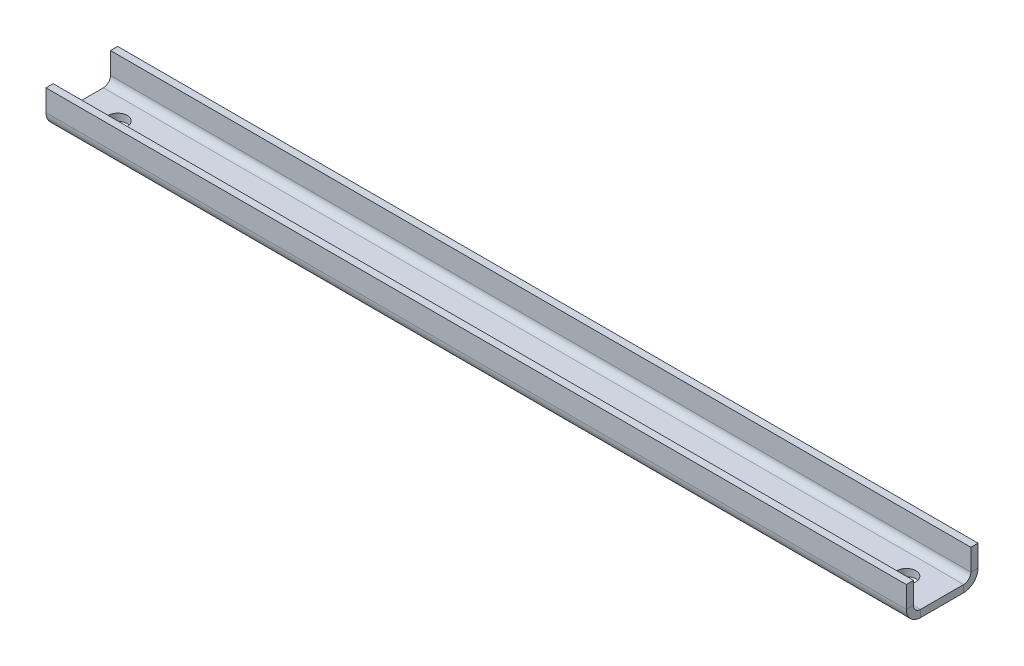
ISO-10303-21;
HEADER;
FILE_DESCRIPTION(('STEP AP214'),'2;1');
FILE_NAME('part.step','',(''),(''),'','','');
FILE_SCHEMA(('AUTOMOTIVE_DESIGN { 1 0 10303 214 1 1 1 1 }'));
ENDSEC;
DATA;
#1=APPLICATION_CONTEXT('core data for automotive mechanical design processes');
#2=APPLICATION_PROTOCOL_DEFINITION('international standard','automotive_design',2000,#1);
#3=PRODUCT_CONTEXT('',#1,'mechanical');
#4=PRODUCT('Part','Part','',(#3));
#5=PRODUCT_RELATED_PRODUCT_CATEGORY('part','',(#4));
#6=PRODUCT_DEFINITION_FORMATION('','',#4);
#7=PRODUCT_DEFINITION_CONTEXT('part definition',#1,'design');
#8=PRODUCT_DEFINITION('design','',#6,#7);
#9=PRODUCT_DEFINITION_SHAPE('','',#8);
#10=(LENGTH_UNIT() NAMED_UNIT(*) SI_UNIT(.MILLI.,.METRE.));
#11=(NAMED_UNIT(*) PLANE_ANGLE_UNIT() SI_UNIT($,.RADIAN.));
#12=(NAMED_UNIT(*) SI_UNIT($,.STERADIAN.) SOLID_ANGLE_UNIT());
#13=UNCERTAINTY_MEASURE_WITH_UNIT(LENGTH_MEASURE(1.E-05),#10,'distance_accuracy_value','');
#14=(GEOMETRIC_REPRESENTATION_CONTEXT(3) GLOBAL_UNCERTAINTY_ASSIGNED_CONTEXT((#13)) GLOBAL_UNIT_ASSIGNED_CONTEXT((#10,
#11,#12)) REPRESENTATION_CONTEXT('',''));
#15=CARTESIAN_POINT('',(0.,0.,0.));
#16=DIRECTION('',(0.,0.,1.));
#17=DIRECTION('',(1.,0.,0.));
#18=AXIS2_PLACEMENT_3D('',#15,#16,#17);
#19=CARTESIAN_POINT('',(0.,-3.,0.));
#20=DIRECTION('',(0.,-1.,0.));
#21=DIRECTION('',(0.,0.,-1.));
#22=AXIS2_PLACEMENT_3D('',#19,#20,#21);
#23=PLANE('',#22);
#24=CARTESIAN_POINT('',(345.,-3.,-15.));
#25=DIRECTION('',(0.,-1.,0.));
#26=DIRECTION('',(0.,0.,-1.));
#27=AXIS2_PLACEMENT_3D('',#24,#25,#26);
#28=CIRCLE('',#27,3.99999999999999);
#29=CARTESIAN_POINT('',(345.,-3.,-19.));
#30=VERTEX_POINT('',#29);
#31=EDGE_CURVE('E598',#30,#30,#28,.F.);
#32=ORIENTED_EDGE('',*,*,#31,.T.);
#33=EDGE_LOOP('',(#32));
#34=FACE_BOUND('',#33,.T.);
#35=CARTESIAN_POINT('',(15.,-3.,-15.));
#36=DIRECTION('',(0.,-1.,0.));
#37=DIRECTION('',(0.,0.,-1.));
#38=AXIS2_PLACEMENT_3D('',#35,#36,#37);
#39=CIRCLE('',#38,4.);
#40=CARTESIAN_POINT('',(15.,-3.,-19.));
#41=VERTEX_POINT('',#40);
#42=EDGE_CURVE('E592',#41,#41,#39,.F.);
#43=ORIENTED_EDGE('',*,*,#42,.T.);
#44=EDGE_LOOP('',(#43));
#45=FACE_BOUND('',#44,.T.);
#46=DIRECTION('',(0.,0.,1.));
#47=VECTOR('',#46,1.);
#48=CARTESIAN_POINT('',(0.,-3.,0.));
#49=LINE('',#48,#47);
#50=CARTESIAN_POINT('',(0.,-3.00000000000003,-24.));
#51=VERTEX_POINT('',#50);
#52=CARTESIAN_POINT('',(0.,-3.,-6.));
#53=VERTEX_POINT('',#52);
#54=EDGE_CURVE('E86',#51,#53,#49,.T.);
#55=ORIENTED_EDGE('',*,*,#54,.F.);
#56=DIRECTION('',(-1.,0.,0.));
#57=VECTOR('',#56,1.);
#58=CARTESIAN_POINT('',(0.,-3.00000000000003,-24.));
#59=LINE('',#58,#57);
#60=CARTESIAN_POINT('',(360.,-3.,-24.));
#61=VERTEX_POINT('',#60);
#62=EDGE_CURVE('E210',#51,#61,#59,.F.);
#63=ORIENTED_EDGE('',*,*,#62,.T.);
#64=DIRECTION('',(0.,0.,-1.));
#65=VECTOR('',#64,1.);
#66=CARTESIAN_POINT('',(360.,-3.,0.));
#67=LINE('',#66,#65);
#68=CARTESIAN_POINT('',(360.,-3.00000000000001,-6.));
#69=VERTEX_POINT('',#68);
#70=EDGE_CURVE('E13',#69,#61,#67,.T.);
#71=ORIENTED_EDGE('',*,*,#70,.F.);
#72=DIRECTION('',(1.,0.,0.));
#73=VECTOR('',#72,1.);
#74=CARTESIAN_POINT('',(360.,-3.00000000000001,-6.));
#75=LINE('',#74,#73);
#76=EDGE_CURVE('E261',#69,#53,#75,.F.);
#77=ORIENTED_EDGE('',*,*,#76,.T.);
#78=EDGE_LOOP('',(#55,#63,#71,#77));
#79=FACE_BOUND('',#78,.T.);
#80=ADVANCED_FACE('F77',(#34,#45,#79),#23,.T.);
#81=CARTESIAN_POINT('',(0.,0.,0.));
#82=DIRECTION('',(0.,-1.,0.));
#83=DIRECTION('',(0.,0.,-1.));
#84=AXIS2_PLACEMENT_3D('',#81,#82,#83);
#85=PLANE('',#84);
#86=CARTESIAN_POINT('',(345.,0.,-15.));
#87=DIRECTION('',(0.,1.,0.));
#88=DIRECTION('',(0.,0.,1.));
#89=AXIS2_PLACEMENT_3D('',#86,#87,#88);
#90=CIRCLE('',#89,3.99999999999999);
#91=CARTESIAN_POINT('',(345.,0.,-11.));
#92=VERTEX_POINT('',#91);
#93=EDGE_CURVE('E595',#92,#92,#90,.T.);
#94=ORIENTED_EDGE('',*,*,#93,.F.);
#95=EDGE_LOOP('',(#94));
#96=FACE_BOUND('',#95,.T.);
#97=CARTESIAN_POINT('',(15.,0.,-15.));
#98=DIRECTION('',(0.,1.,0.));
#99=DIRECTION('',(0.,0.,1.));
#100=AXIS2_PLACEMENT_3D('',#97,#98,#99);
#101=CIRCLE('',#100,4.);
#102=CARTESIAN_POINT('',(15.,0.,-11.));
#103=VERTEX_POINT('',#102);
#104=EDGE_CURVE('E209',#103,#103,#101,.T.);
#105=ORIENTED_EDGE('',*,*,#104,.F.);
#106=EDGE_LOOP('',(#105));
#107=FACE_BOUND('',#106,.T.);
#108=DIRECTION('',(-1.,0.,0.));
#109=VECTOR('',#108,1.);
#110=CARTESIAN_POINT('',(0.,0.,-24.));
#111=LINE('',#110,#109);
#112=CARTESIAN_POINT('',(0.,0.,-24.));
#113=VERTEX_POINT('',#112);
#114=CARTESIAN_POINT('',(360.,0.,-24.));
#115=VERTEX_POINT('',#114);
#116=EDGE_CURVE('E221',#113,#115,#111,.F.);
#117=ORIENTED_EDGE('',*,*,#116,.F.);
#118=DIRECTION('',(0.,0.,1.));
#119=VECTOR('',#118,1.);
#120=CARTESIAN_POINT('',(0.,0.,0.));
#121=LINE('',#120,#119);
#122=CARTESIAN_POINT('',(0.,0.,-6.));
#123=VERTEX_POINT('',#122);
#124=EDGE_CURVE('E278',#113,#123,#121,.T.);
#125=ORIENTED_EDGE('',*,*,#124,.T.);
#126=DIRECTION('',(1.,0.,0.));
#127=VECTOR('',#126,1.);
#128=CARTESIAN_POINT('',(360.,0.,-6.));
#129=LINE('',#128,#127);
#130=CARTESIAN_POINT('',(360.,0.,-6.));
#131=VERTEX_POINT('',#130);
#132=EDGE_CURVE('E272',#131,#123,#129,.F.);
#133=ORIENTED_EDGE('',*,*,#132,.F.);
#134=DIRECTION('',(0.,0.,-1.));
#135=VECTOR('',#134,1.);
#136=CARTESIAN_POINT('',(360.,0.,0.));
#137=LINE('',#136,#135);
#138=EDGE_CURVE('E81',#131,#115,#137,.T.);
#139=ORIENTED_EDGE('',*,*,#138,.T.);
#140=EDGE_LOOP('',(#117,#125,#133,#139));
#141=FACE_BOUND('',#140,.T.);
#142=ADVANCED_FACE('F290',(#96,#107,#141),#85,.F.);
#143=CARTESIAN_POINT('',(0.,-3.,0.));
#144=DIRECTION('',(-1.,0.,0.));
#145=DIRECTION('',(0.,0.,1.));
#146=AXIS2_PLACEMENT_3D('',#143,#144,#145);
#147=PLANE('',#146);
#148=ORIENTED_EDGE('',*,*,#124,.F.);
#149=DIRECTION('',(0.,-1.,0.));
#150=VECTOR('',#149,1.);
#151=CARTESIAN_POINT('',(0.,0.,-24.));
#152=LINE('',#151,#150);
#153=EDGE_CURVE('E215',#113,#51,#152,.T.);
#154=ORIENTED_EDGE('',*,*,#153,.T.);
#155=ORIENTED_EDGE('',*,*,#54,.T.);
#156=DIRECTION('',(0.,-1.,0.));
#157=VECTOR('',#156,1.);
#158=CARTESIAN_POINT('',(0.,0.,-6.));
#159=LINE('',#158,#157);
#160=EDGE_CURVE('E276',#123,#53,#159,.T.);
#161=ORIENTED_EDGE('',*,*,#160,.F.);
#162=EDGE_LOOP('',(#148,#154,#155,#161));
#163=FACE_BOUND('',#162,.T.);
#164=ADVANCED_FACE('F79',(#163),#147,.T.);
#165=CARTESIAN_POINT('',(360.,-3.,0.));
#166=DIRECTION('',(1.,0.,0.));
#167=DIRECTION('',(0.,0.,-1.));
#168=AXIS2_PLACEMENT_3D('',#165,#166,#167);
#169=PLANE('',#168);
#170=DIRECTION('',(0.,-1.,0.));
#171=VECTOR('',#170,1.);
#172=CARTESIAN_POINT('',(360.,0.,-24.));
#173=LINE('',#172,#171);
#174=EDGE_CURVE('E226',#115,#61,#173,.T.);
#175=ORIENTED_EDGE('',*,*,#174,.F.);
#176=ORIENTED_EDGE('',*,*,#138,.F.);
#177=DIRECTION('',(0.,-1.,0.));
#178=VECTOR('',#177,1.);
#179=CARTESIAN_POINT('',(360.,0.,-6.));
#180=LINE('',#179,#178);
#181=EDGE_CURVE('E266',#131,#69,#180,.T.);
#182=ORIENTED_EDGE('',*,*,#181,.T.);
#183=ORIENTED_EDGE('',*,*,#70,.T.);
#184=EDGE_LOOP('',(#175,#176,#182,#183));
#185=FACE_BOUND('',#184,.T.);
#186=ADVANCED_FACE('F293',(#185),#169,.T.);
#187=CARTESIAN_POINT('',(0.,2.99999999999999,-6.));
#188=DIRECTION('',(-1.,0.,0.));
#189=DIRECTION('',(0.,0.,1.));
#190=AXIS2_PLACEMENT_3D('',#187,#188,#189);
#191=PLANE('',#190);
#192=DIRECTION('',(0.,0.,-1.));
#193=VECTOR('',#192,1.);
#194=CARTESIAN_POINT('',(0.,2.99999999999999,0.));
#195=LINE('',#194,#193);
#196=CARTESIAN_POINT('',(0.,2.99999999999999,-3.));
#197=VERTEX_POINT('',#196);
#198=CARTESIAN_POINT('',(0.,2.99999999999999,0.));
#199=VERTEX_POINT('',#198);
#200=EDGE_CURVE('E228',#197,#199,#195,.F.);
#201=ORIENTED_EDGE('',*,*,#200,.F.);
#202=CARTESIAN_POINT('',(0.,2.99999999999999,-6.));
#203=DIRECTION('',(1.,0.,0.));
#204=DIRECTION('',(0.,0.,-1.));
#205=AXIS2_PLACEMENT_3D('',#202,#203,#204);
#206=CIRCLE('',#205,3.);
#207=EDGE_CURVE('E269',#123,#197,#206,.F.);
#208=ORIENTED_EDGE('',*,*,#207,.F.);
#209=ORIENTED_EDGE('',*,*,#160,.T.);
#210=CARTESIAN_POINT('',(0.,2.99999999999999,-6.));
#211=DIRECTION('',(1.,0.,0.));
#212=DIRECTION('',(0.,0.,-1.));
#213=AXIS2_PLACEMENT_3D('',#210,#211,#212);
#214=CIRCLE('',#213,6.);
#215=EDGE_CURVE('E94',#53,#199,#214,.F.);
#216=ORIENTED_EDGE('',*,*,#215,.T.);
#217=EDGE_LOOP('',(#201,#208,#209,#216));
#218=FACE_BOUND('',#217,.T.);
#219=ADVANCED_FACE('F308',(#218),#191,.T.);
#220=CARTESIAN_POINT('',(360.,2.99999999999999,-6.));
#221=DIRECTION('',(-1.,0.,0.));
#222=DIRECTION('',(0.,0.,1.));
#223=AXIS2_PLACEMENT_3D('',#220,#221,#222);
#224=PLANE('',#223);
#225=CARTESIAN_POINT('',(360.,2.99999999999999,-6.));
#226=DIRECTION('',(1.,0.,0.));
#227=DIRECTION('',(0.,0.,-1.));
#228=AXIS2_PLACEMENT_3D('',#225,#226,#227);
#229=CIRCLE('',#228,3.);
#230=CARTESIAN_POINT('',(360.,2.99999999999999,-3.));
#231=VERTEX_POINT('',#230);
#232=EDGE_CURVE('E234',#231,#131,#229,.T.);
#233=ORIENTED_EDGE('',*,*,#232,.F.);
#234=DIRECTION('',(0.,0.,-1.));
#235=VECTOR('',#234,1.);
#236=CARTESIAN_POINT('',(360.,2.99999999999999,-2.99999999999999));
#237=LINE('',#236,#235);
#238=CARTESIAN_POINT('',(360.,2.99999999999999,0.));
#239=VERTEX_POINT('',#238);
#240=EDGE_CURVE('E254',#231,#239,#237,.F.);
#241=ORIENTED_EDGE('',*,*,#240,.T.);
#242=CARTESIAN_POINT('',(360.,2.99999999999999,-6.));
#243=DIRECTION('',(1.,0.,0.));
#244=DIRECTION('',(0.,0.,-1.));
#245=AXIS2_PLACEMENT_3D('',#242,#243,#244);
#246=CIRCLE('',#245,6.);
#247=EDGE_CURVE('E264',#239,#69,#246,.T.);
#248=ORIENTED_EDGE('',*,*,#247,.T.);
#249=ORIENTED_EDGE('',*,*,#181,.F.);
#250=EDGE_LOOP('',(#233,#241,#248,#249));
#251=FACE_BOUND('',#250,.T.);
#252=ADVANCED_FACE('F332',(#251),#224,.F.);
#253=CARTESIAN_POINT('',(360.,2.99999999999999,-6.));
#254=DIRECTION('',(1.,0.,0.));
#255=DIRECTION('',(0.,0.,1.));
#256=AXIS2_PLACEMENT_3D('',#253,#254,#255);
#257=CYLINDRICAL_SURFACE('',#256,6.);
#258=ORIENTED_EDGE('',*,*,#76,.F.);
#259=ORIENTED_EDGE('',*,*,#247,.F.);
#260=DIRECTION('',(1.,0.,0.));
#261=VECTOR('',#260,1.);
#262=CARTESIAN_POINT('',(0.,2.99999999999999,0.));
#263=LINE('',#262,#261);
#264=EDGE_CURVE('E252',#239,#199,#263,.F.);
#265=ORIENTED_EDGE('',*,*,#264,.T.);
#266=ORIENTED_EDGE('',*,*,#215,.F.);
#267=EDGE_LOOP('',(#258,#259,#265,#266));
#268=FACE_BOUND('',#267,.T.);
#269=ADVANCED_FACE('F335',(#268),#257,.T.);
#270=CARTESIAN_POINT('',(360.,2.99999999999999,-6.));
#271=DIRECTION('',(1.,0.,0.));
#272=DIRECTION('',(0.,0.,1.));
#273=AXIS2_PLACEMENT_3D('',#270,#271,#272);
#274=CYLINDRICAL_SURFACE('',#273,3.);
#275=ORIENTED_EDGE('',*,*,#132,.T.);
#276=ORIENTED_EDGE('',*,*,#207,.T.);
#277=DIRECTION('',(1.,0.,0.));
#278=VECTOR('',#277,1.);
#279=CARTESIAN_POINT('',(0.,2.99999999999999,-3.));
#280=LINE('',#279,#278);
#281=EDGE_CURVE('E257',#197,#231,#280,.T.);
#282=ORIENTED_EDGE('',*,*,#281,.T.);
#283=ORIENTED_EDGE('',*,*,#232,.T.);
#284=EDGE_LOOP('',(#275,#276,#282,#283));
#285=FACE_BOUND('',#284,.T.);
#286=ADVANCED_FACE('F311',(#285),#274,.F.);
#287=CARTESIAN_POINT('',(0.,0.,0.));
#288=DIRECTION('',(1.,0.,0.));
#289=DIRECTION('',(0.,0.,-1.));
#290=AXIS2_PLACEMENT_3D('',#287,#288,#289);
#291=PLANE('',#290);
#292=ORIENTED_EDGE('',*,*,#200,.T.);
#293=DIRECTION('',(0.,-1.,0.));
#294=VECTOR('',#293,1.);
#295=CARTESIAN_POINT('',(0.,0.,0.));
#296=LINE('',#295,#294);
#297=CARTESIAN_POINT('',(0.,12.,0.));
#298=VERTEX_POINT('',#297);
#299=EDGE_CURVE('E242',#298,#199,#296,.T.);
#300=ORIENTED_EDGE('',*,*,#299,.F.);
#301=DIRECTION('',(0.,0.,-1.));
#302=VECTOR('',#301,1.);
#303=CARTESIAN_POINT('',(0.,12.,0.));
#304=LINE('',#303,#302);
#305=CARTESIAN_POINT('',(0.,12.,-3.));
#306=VERTEX_POINT('',#305);
#307=EDGE_CURVE('E235',#298,#306,#304,.T.);
#308=ORIENTED_EDGE('',*,*,#307,.T.);
#309=DIRECTION('',(0.,1.,0.));
#310=VECTOR('',#309,1.);
#311=CARTESIAN_POINT('',(0.,0.,-3.));
#312=LINE('',#311,#310);
#313=EDGE_CURVE('E249',#306,#197,#312,.F.);
#314=ORIENTED_EDGE('',*,*,#313,.T.);
#315=EDGE_LOOP('',(#292,#300,#308,#314));
#316=FACE_BOUND('',#315,.T.);
#317=ADVANCED_FACE('F319',(#316),#291,.F.);
#318=CARTESIAN_POINT('',(360.,12.,0.));
#319=DIRECTION('',(-1.,0.,0.));
#320=DIRECTION('',(0.,0.,1.));
#321=AXIS2_PLACEMENT_3D('',#318,#319,#320);
#322=PLANE('',#321);
#323=ORIENTED_EDGE('',*,*,#240,.F.);
#324=DIRECTION('',(0.,-1.,0.));
#325=VECTOR('',#324,1.);
#326=CARTESIAN_POINT('',(360.,12.,-3.));
#327=LINE('',#326,#325);
#328=CARTESIAN_POINT('',(360.,12.,-3.));
#329=VERTEX_POINT('',#328);
#330=EDGE_CURVE('E247',#231,#329,#327,.F.);
#331=ORIENTED_EDGE('',*,*,#330,.T.);
#332=DIRECTION('',(0.,0.,-1.));
#333=VECTOR('',#332,1.);
#334=CARTESIAN_POINT('',(360.,12.,0.));
#335=LINE('',#334,#333);
#336=CARTESIAN_POINT('',(360.,12.,0.));
#337=VERTEX_POINT('',#336);
#338=EDGE_CURVE('E231',#337,#329,#335,.T.);
#339=ORIENTED_EDGE('',*,*,#338,.F.);
#340=DIRECTION('',(0.,1.,0.));
#341=VECTOR('',#340,1.);
#342=CARTESIAN_POINT('',(360.,0.,0.));
#343=LINE('',#342,#341);
#344=EDGE_CURVE('E240',#239,#337,#343,.T.);
#345=ORIENTED_EDGE('',*,*,#344,.F.);
#346=EDGE_LOOP('',(#323,#331,#339,#345));
#347=FACE_BOUND('',#346,.T.);
#348=ADVANCED_FACE('F329',(#347),#322,.F.);
#349=CARTESIAN_POINT('',(0.,0.,0.));
#350=DIRECTION('',(0.,0.,-1.));
#351=DIRECTION('',(-1.,0.,0.));
#352=AXIS2_PLACEMENT_3D('',#349,#350,#351);
#353=PLANE('',#352);
#354=ORIENTED_EDGE('',*,*,#264,.F.);
#355=ORIENTED_EDGE('',*,*,#344,.T.);
#356=DIRECTION('',(-1.,0.,0.));
#357=VECTOR('',#356,1.);
#358=CARTESIAN_POINT('',(0.,12.,0.));
#359=LINE('',#358,#357);
#360=EDGE_CURVE('E238',#337,#298,#359,.T.);
#361=ORIENTED_EDGE('',*,*,#360,.T.);
#362=ORIENTED_EDGE('',*,*,#299,.T.);
#363=EDGE_LOOP('',(#354,#355,#361,#362));
#364=FACE_BOUND('',#363,.T.);
#365=ADVANCED_FACE('F334',(#364),#353,.F.);
#366=CARTESIAN_POINT('',(0.,0.,-3.));
#367=DIRECTION('',(0.,0.,-1.));
#368=DIRECTION('',(-1.,0.,0.));
#369=AXIS2_PLACEMENT_3D('',#366,#367,#368);
#370=PLANE('',#369);
#371=ORIENTED_EDGE('',*,*,#330,.F.);
#372=ORIENTED_EDGE('',*,*,#281,.F.);
#373=ORIENTED_EDGE('',*,*,#313,.F.);
#374=DIRECTION('',(1.,0.,0.));
#375=VECTOR('',#374,1.);
#376=CARTESIAN_POINT('',(0.,12.,-3.));
#377=LINE('',#376,#375);
#378=EDGE_CURVE('E245',#329,#306,#377,.F.);
#379=ORIENTED_EDGE('',*,*,#378,.F.);
#380=EDGE_LOOP('',(#371,#372,#373,#379));
#381=FACE_BOUND('',#380,.T.);
#382=ADVANCED_FACE('F316',(#381),#370,.T.);
#383=CARTESIAN_POINT('',(0.,12.,0.));
#384=DIRECTION('',(0.,-1.,0.));
#385=DIRECTION('',(0.,0.,-1.));
#386=AXIS2_PLACEMENT_3D('',#383,#384,#385);
#387=PLANE('',#386);
#388=ORIENTED_EDGE('',*,*,#378,.T.);
#389=ORIENTED_EDGE('',*,*,#307,.F.);
#390=ORIENTED_EDGE('',*,*,#360,.F.);
#391=ORIENTED_EDGE('',*,*,#338,.T.);
#392=EDGE_LOOP('',(#388,#389,#390,#391));
#393=FACE_BOUND('',#392,.T.);
#394=ADVANCED_FACE('F324',(#393),#387,.F.);
#395=CARTESIAN_POINT('',(360.,2.99999999999997,-24.));
#396=DIRECTION('',(1.,0.,0.));
#397=DIRECTION('',(0.,0.,-1.));
#398=AXIS2_PLACEMENT_3D('',#395,#396,#397);
#399=PLANE('',#398);
#400=DIRECTION('',(0.,0.,1.));
#401=VECTOR('',#400,1.);
#402=CARTESIAN_POINT('',(360.,3.00000000000001,-30.));
#403=LINE('',#402,#401);
#404=CARTESIAN_POINT('',(360.,2.99999999999996,-27.));
#405=VERTEX_POINT('',#404);
#406=CARTESIAN_POINT('',(360.,2.99999999999995,-30.));
#407=VERTEX_POINT('',#406);
#408=EDGE_CURVE('E192',#405,#407,#403,.F.);
#409=ORIENTED_EDGE('',*,*,#408,.F.);
#410=CARTESIAN_POINT('',(360.,2.99999999999997,-24.));
#411=DIRECTION('',(-1.,0.,0.));
#412=DIRECTION('',(0.,0.,1.));
#413=AXIS2_PLACEMENT_3D('',#410,#411,#412);
#414=CIRCLE('',#413,3.);
#415=EDGE_CURVE('E218',#115,#405,#414,.F.);
#416=ORIENTED_EDGE('',*,*,#415,.F.);
#417=ORIENTED_EDGE('',*,*,#174,.T.);
#418=CARTESIAN_POINT('',(360.,2.99999999999997,-24.));
#419=DIRECTION('',(-1.,0.,0.));
#420=DIRECTION('',(0.,0.,1.));
#421=AXIS2_PLACEMENT_3D('',#418,#419,#420);
#422=CIRCLE('',#421,6.);
#423=EDGE_CURVE('E102',#61,#407,#422,.F.);
#424=ORIENTED_EDGE('',*,*,#423,.T.);
#425=EDGE_LOOP('',(#409,#416,#417,#424));
#426=FACE_BOUND('',#425,.T.);
#427=ADVANCED_FACE('F297',(#426),#399,.T.);
#428=CARTESIAN_POINT('',(0.,2.99999999999997,-24.));
#429=DIRECTION('',(1.,0.,0.));
#430=DIRECTION('',(0.,0.,-1.));
#431=AXIS2_PLACEMENT_3D('',#428,#429,#430);
#432=PLANE('',#431);
#433=CARTESIAN_POINT('',(0.,2.99999999999997,-24.));
#434=DIRECTION('',(-1.,0.,0.));
#435=DIRECTION('',(0.,0.,1.));
#436=AXIS2_PLACEMENT_3D('',#433,#434,#435);
#437=CIRCLE('',#436,3.);
#438=CARTESIAN_POINT('',(0.,2.99999999999996,-27.));
#439=VERTEX_POINT('',#438);
#440=EDGE_CURVE('E223',#439,#113,#437,.T.);
#441=ORIENTED_EDGE('',*,*,#440,.F.);
#442=DIRECTION('',(0.,0.,1.));
#443=VECTOR('',#442,1.);
#444=CARTESIAN_POINT('',(0.,3.,-27.));
#445=LINE('',#444,#443);
#446=CARTESIAN_POINT('',(0.,3.00000000000002,-30.));
#447=VERTEX_POINT('',#446);
#448=EDGE_CURVE('E203',#439,#447,#445,.F.);
#449=ORIENTED_EDGE('',*,*,#448,.T.);
#450=CARTESIAN_POINT('',(0.,2.99999999999997,-24.));
#451=DIRECTION('',(-1.,0.,0.));
#452=DIRECTION('',(0.,0.,1.));
#453=AXIS2_PLACEMENT_3D('',#450,#451,#452);
#454=CIRCLE('',#453,6.);
#455=EDGE_CURVE('E213',#447,#51,#454,.T.);
#456=ORIENTED_EDGE('',*,*,#455,.T.);
#457=ORIENTED_EDGE('',*,*,#153,.F.);
#458=EDGE_LOOP('',(#441,#449,#456,#457));
#459=FACE_BOUND('',#458,.T.);
#460=ADVANCED_FACE('F303',(#459),#432,.F.);
#461=CARTESIAN_POINT('',(0.,2.99999999999997,-24.));
#462=DIRECTION('',(-1.,0.,0.));
#463=DIRECTION('',(0.,0.,-1.));
#464=AXIS2_PLACEMENT_3D('',#461,#462,#463);
#465=CYLINDRICAL_SURFACE('',#464,6.);
#466=ORIENTED_EDGE('',*,*,#62,.F.);
#467=ORIENTED_EDGE('',*,*,#455,.F.);
#468=DIRECTION('',(-1.,0.,0.));
#469=VECTOR('',#468,1.);
#470=CARTESIAN_POINT('',(360.,3.00000000000001,-30.));
#471=LINE('',#470,#469);
#472=EDGE_CURVE('E201',#447,#407,#471,.F.);
#473=ORIENTED_EDGE('',*,*,#472,.T.);
#474=ORIENTED_EDGE('',*,*,#423,.F.);
#475=EDGE_LOOP('',(#466,#467,#473,#474));
#476=FACE_BOUND('',#475,.T.);
#477=ADVANCED_FACE('F300',(#476),#465,.T.);
#478=CARTESIAN_POINT('',(0.,2.99999999999997,-24.));
#479=DIRECTION('',(-1.,0.,0.));
#480=DIRECTION('',(0.,0.,-1.));
#481=AXIS2_PLACEMENT_3D('',#478,#479,#480);
#482=CYLINDRICAL_SURFACE('',#481,3.);
#483=ORIENTED_EDGE('',*,*,#116,.T.);
#484=ORIENTED_EDGE('',*,*,#415,.T.);
#485=DIRECTION('',(-1.,0.,0.));
#486=VECTOR('',#485,1.);
#487=CARTESIAN_POINT('',(360.,2.99999999999999,-27.));
#488=LINE('',#487,#486);
#489=EDGE_CURVE('E206',#405,#439,#488,.T.);
#490=ORIENTED_EDGE('',*,*,#489,.T.);
#491=ORIENTED_EDGE('',*,*,#440,.T.);
#492=EDGE_LOOP('',(#483,#484,#490,#491));
#493=FACE_BOUND('',#492,.T.);
#494=ADVANCED_FACE('F440',(#493),#482,.F.);
#495=CARTESIAN_POINT('',(360.,0.,-30.));
#496=DIRECTION('',(-1.,0.,0.));
#497=DIRECTION('',(0.,0.,1.));
#498=AXIS2_PLACEMENT_3D('',#495,#496,#497);
#499=PLANE('',#498);
#500=ORIENTED_EDGE('',*,*,#408,.T.);
#501=DIRECTION('',(0.,-1.,0.));
#502=VECTOR('',#501,1.);
#503=CARTESIAN_POINT('',(360.,-1.14557852575138E-13,-30.));
#504=LINE('',#503,#502);
#505=CARTESIAN_POINT('',(360.,12.,-30.));
#506=VERTEX_POINT('',#505);
#507=EDGE_CURVE('E173',#506,#407,#504,.T.);
#508=ORIENTED_EDGE('',*,*,#507,.F.);
#509=DIRECTION('',(0.,0.,1.));
#510=VECTOR('',#509,1.);
#511=CARTESIAN_POINT('',(360.,12.,-30.));
#512=LINE('',#511,#510);
#513=CARTESIAN_POINT('',(360.,12.,-27.));
#514=VERTEX_POINT('',#513);
#515=EDGE_CURVE('E179',#506,#514,#512,.T.);
#516=ORIENTED_EDGE('',*,*,#515,.T.);
#517=DIRECTION('',(0.,1.,0.));
#518=VECTOR('',#517,1.);
#519=CARTESIAN_POINT('',(360.,0.,-27.));
#520=LINE('',#519,#518);
#521=EDGE_CURVE('E199',#514,#405,#520,.F.);
#522=ORIENTED_EDGE('',*,*,#521,.T.);
#523=EDGE_LOOP('',(#500,#508,#516,#522));
#524=FACE_BOUND('',#523,.T.);
#525=ADVANCED_FACE('F191',(#524),#499,.F.);
#526=CARTESIAN_POINT('',(1.11022302462516E-13,12.,-30.));
#527=DIRECTION('',(1.,0.,0.));
#528=DIRECTION('',(0.,1.,0.));
#529=AXIS2_PLACEMENT_3D('',#526,#527,#528);
#530=PLANE('',#529);
#531=ORIENTED_EDGE('',*,*,#448,.F.);
#532=DIRECTION('',(0.,-1.,0.));
#533=VECTOR('',#532,1.);
#534=CARTESIAN_POINT('',(1.11022302462516E-13,12.,-27.));
#535=LINE('',#534,#533);
#536=CARTESIAN_POINT('',(1.11022302462516E-13,12.,-27.));
#537=VERTEX_POINT('',#536);
#538=EDGE_CURVE('E195',#439,#537,#535,.F.);
#539=ORIENTED_EDGE('',*,*,#538,.T.);
#540=DIRECTION('',(0.,0.,1.));
#541=VECTOR('',#540,1.);
#542=CARTESIAN_POINT('',(1.11022302462516E-13,12.,-30.));
#543=LINE('',#542,#541);
#544=CARTESIAN_POINT('',(1.11022302462516E-13,12.,-30.));
#545=VERTEX_POINT('',#544);
#546=EDGE_CURVE('E188',#545,#537,#543,.T.);
#547=ORIENTED_EDGE('',*,*,#546,.F.);
#548=DIRECTION('',(0.,1.,0.));
#549=VECTOR('',#548,1.);
#550=CARTESIAN_POINT('',(0.,-1.14557852575138E-13,-30.));
#551=LINE('',#550,#549);
#552=EDGE_CURVE('E175',#447,#545,#551,.T.);
#553=ORIENTED_EDGE('',*,*,#552,.F.);
#554=EDGE_LOOP('',(#531,#539,#547,#553));
#555=FACE_BOUND('',#554,.T.);
#556=ADVANCED_FACE('F422',(#555),#530,.F.);
#557=CARTESIAN_POINT('',(0.,-1.14557852575138E-13,-30.));
#558=DIRECTION('',(0.,0.,1.));
#559=DIRECTION('',(0.,-1.,0.));
#560=AXIS2_PLACEMENT_3D('',#557,#558,#559);
#561=PLANE('',#560);
#562=ORIENTED_EDGE('',*,*,#472,.F.);
#563=ORIENTED_EDGE('',*,*,#552,.T.);
#564=DIRECTION('',(1.,0.,0.));
#565=VECTOR('',#564,1.);
#566=CARTESIAN_POINT('',(0.,12.,-30.));
#567=LINE('',#566,#565);
#568=EDGE_CURVE('E168',#545,#506,#567,.T.);
#569=ORIENTED_EDGE('',*,*,#568,.T.);
#570=ORIENTED_EDGE('',*,*,#507,.T.);
#571=EDGE_LOOP('',(#562,#563,#569,#570));
#572=FACE_BOUND('',#571,.T.);
#573=ADVANCED_FACE('F171',(#572),#561,.F.);
#574=CARTESIAN_POINT('',(0.,-1.04083408558608E-13,-27.));
#575=DIRECTION('',(0.,0.,1.));
#576=DIRECTION('',(0.,-1.,0.));
#577=AXIS2_PLACEMENT_3D('',#574,#575,#576);
#578=PLANE('',#577);
#579=ORIENTED_EDGE('',*,*,#538,.F.);
#580=ORIENTED_EDGE('',*,*,#489,.F.);
#581=ORIENTED_EDGE('',*,*,#521,.F.);
#582=DIRECTION('',(-1.,0.,0.));
#583=VECTOR('',#582,1.);
#584=CARTESIAN_POINT('',(360.,12.,-27.));
#585=LINE('',#584,#583);
#586=EDGE_CURVE('E184',#537,#514,#585,.F.);
#587=ORIENTED_EDGE('',*,*,#586,.F.);
#588=EDGE_LOOP('',(#579,#580,#581,#587));
#589=FACE_BOUND('',#588,.T.);
#590=ADVANCED_FACE('F405',(#589),#578,.T.);
#591=CARTESIAN_POINT('',(360.,12.,-30.));
#592=DIRECTION('',(0.,-1.,0.));
#593=DIRECTION('',(0.,0.,-1.));
#594=AXIS2_PLACEMENT_3D('',#591,#592,#593);
#595=PLANE('',#594);
#596=ORIENTED_EDGE('',*,*,#586,.T.);
#597=ORIENTED_EDGE('',*,*,#515,.F.);
#598=ORIENTED_EDGE('',*,*,#568,.F.);
#599=ORIENTED_EDGE('',*,*,#546,.T.);
#600=EDGE_LOOP('',(#596,#597,#598,#599));
#601=FACE_BOUND('',#600,.T.);
#602=ADVANCED_FACE('F182',(#601),#595,.F.);
#603=CARTESIAN_POINT('',(15.,-3.00100000000003,-15.));
#604=DIRECTION('',(0.,1.,0.));
#605=DIRECTION('',(0.,0.,1.));
#606=AXIS2_PLACEMENT_3D('',#603,#604,#605);
#607=CYLINDRICAL_SURFACE('',#606,4.);
#608=ORIENTED_EDGE('',*,*,#42,.F.);
#609=EDGE_LOOP('',(#608));
#610=FACE_BOUND('',#609,.T.);
#611=ORIENTED_EDGE('',*,*,#104,.T.);
#612=EDGE_LOOP('',(#611));
#613=FACE_BOUND('',#612,.T.);
#614=ADVANCED_FACE('F377',(#610,#613),#607,.F.);
#615=CARTESIAN_POINT('',(345.,-3.00100000000003,-15.));
#616=DIRECTION('',(0.,1.,0.));
#617=DIRECTION('',(0.,0.,1.));
#618=AXIS2_PLACEMENT_3D('',#615,#616,#617);
#619=CYLINDRICAL_SURFACE('',#618,3.99999999999999);
#620=ORIENTED_EDGE('',*,*,#31,.F.);
#621=EDGE_LOOP('',(#620));
#622=FACE_BOUND('',#621,.T.);
#623=ORIENTED_EDGE('',*,*,#93,.T.);
#624=EDGE_LOOP('',(#623));
#625=FACE_BOUND('',#624,.T.);
#626=ADVANCED_FACE('F382',(#622,#625),#619,.F.);
#627=CLOSED_SHELL('',(#80,#142,#164,#186,#219,#252,#269,#286,#317,#348,#365,#382,#394,#427,#460,
#477,#494,#525,#556,#573,#590,#602,#614,#626));
#628=MANIFOLD_SOLID_BREP('B2',#627);
#629=ADVANCED_BREP_SHAPE_REPRESENTATION('',(#18,#628),#14);
#630=SHAPE_DEFINITION_REPRESENTATION(#9,#629);
ENDSEC;
END-ISO-10303-21;
